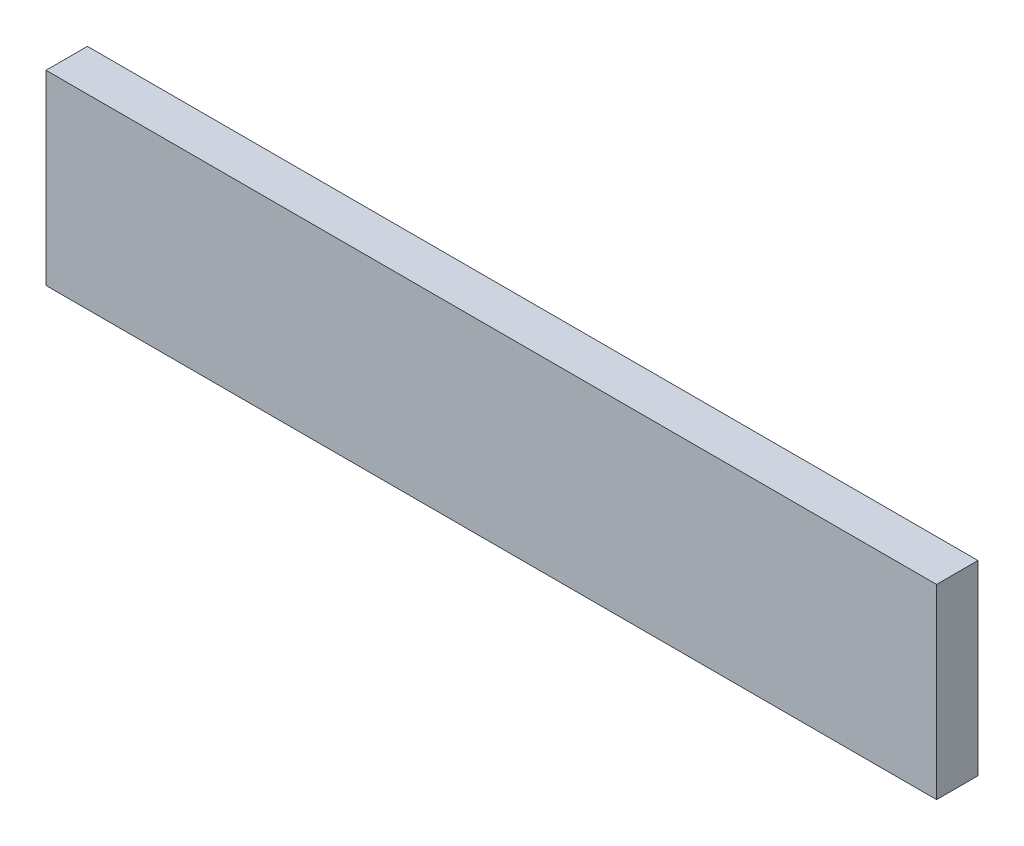
ISO-10303-21;
HEADER;
FILE_DESCRIPTION(('STEP AP214'),'2;1');
FILE_NAME('part.step','',(''),(''),'','','');
FILE_SCHEMA(('AUTOMOTIVE_DESIGN { 1 0 10303 214 1 1 1 1 }'));
ENDSEC;
DATA;
#1=APPLICATION_CONTEXT('core data for automotive mechanical design processes');
#2=APPLICATION_PROTOCOL_DEFINITION('international standard','automotive_design',2000,#1);
#3=PRODUCT_CONTEXT('',#1,'mechanical');
#4=PRODUCT('Part','Part','',(#3));
#5=PRODUCT_RELATED_PRODUCT_CATEGORY('part','',(#4));
#6=PRODUCT_DEFINITION_FORMATION('','',#4);
#7=PRODUCT_DEFINITION_CONTEXT('part definition',#1,'design');
#8=PRODUCT_DEFINITION('design','',#6,#7);
#9=PRODUCT_DEFINITION_SHAPE('','',#8);
#10=(LENGTH_UNIT() NAMED_UNIT(*) SI_UNIT(.MILLI.,.METRE.));
#11=(NAMED_UNIT(*) PLANE_ANGLE_UNIT() SI_UNIT($,.RADIAN.));
#12=(NAMED_UNIT(*) SI_UNIT($,.STERADIAN.) SOLID_ANGLE_UNIT());
#13=UNCERTAINTY_MEASURE_WITH_UNIT(LENGTH_MEASURE(1.E-05),#10,'distance_accuracy_value','');
#14=(GEOMETRIC_REPRESENTATION_CONTEXT(3) GLOBAL_UNCERTAINTY_ASSIGNED_CONTEXT((#13)) GLOBAL_UNIT_ASSIGNED_CONTEXT((#10,
#11,#12)) REPRESENTATION_CONTEXT('',''));
#15=CARTESIAN_POINT('',(0.,0.,0.));
#16=DIRECTION('',(0.,0.,1.));
#17=DIRECTION('',(1.,0.,0.));
#18=AXIS2_PLACEMENT_3D('',#15,#16,#17);
#19=CARTESIAN_POINT('',(0.,18.,4.));
#20=DIRECTION('',(1.,0.,0.));
#21=DIRECTION('',(0.,0.,-1.));
#22=AXIS2_PLACEMENT_3D('',#19,#20,#21);
#23=PLANE('',#22);
#24=DIRECTION('',(0.,-1.,0.));
#25=VECTOR('',#24,1.);
#26=CARTESIAN_POINT('',(0.,18.,0.));
#27=LINE('',#26,#25);
#28=CARTESIAN_POINT('',(0.,18.,0.));
#29=VERTEX_POINT('',#28);
#30=CARTESIAN_POINT('',(0.,0.,0.));
#31=VERTEX_POINT('',#30);
#32=EDGE_CURVE('E102',#29,#31,#27,.T.);
#33=ORIENTED_EDGE('',*,*,#32,.T.);
#34=DIRECTION('',(0.,0.,-1.));
#35=VECTOR('',#34,1.);
#36=CARTESIAN_POINT('',(0.,0.,4.));
#37=LINE('',#36,#35);
#38=CARTESIAN_POINT('',(0.,0.,4.));
#39=VERTEX_POINT('',#38);
#40=EDGE_CURVE('E11',#39,#31,#37,.T.);
#41=ORIENTED_EDGE('',*,*,#40,.F.);
#42=DIRECTION('',(0.,-1.,0.));
#43=VECTOR('',#42,1.);
#44=CARTESIAN_POINT('',(0.,18.,4.));
#45=LINE('',#44,#43);
#46=CARTESIAN_POINT('',(0.,18.,4.));
#47=VERTEX_POINT('',#46);
#48=EDGE_CURVE('E90',#47,#39,#45,.T.);
#49=ORIENTED_EDGE('',*,*,#48,.F.);
#50=DIRECTION('',(0.,0.,-1.));
#51=VECTOR('',#50,1.);
#52=CARTESIAN_POINT('',(0.,18.,4.));
#53=LINE('',#52,#51);
#54=EDGE_CURVE('E98',#47,#29,#53,.T.);
#55=ORIENTED_EDGE('',*,*,#54,.T.);
#56=EDGE_LOOP('',(#33,#41,#49,#55));
#57=FACE_BOUND('',#56,.T.);
#58=ADVANCED_FACE('F39',(#57),#23,.F.);
#59=CARTESIAN_POINT('',(0.,0.,4.));
#60=DIRECTION('',(0.,1.,0.));
#61=DIRECTION('',(0.,0.,1.));
#62=AXIS2_PLACEMENT_3D('',#59,#60,#61);
#63=PLANE('',#62);
#64=DIRECTION('',(1.,0.,0.));
#65=VECTOR('',#64,1.);
#66=CARTESIAN_POINT('',(0.,0.,0.));
#67=LINE('',#66,#65);
#68=CARTESIAN_POINT('',(86.,0.,0.));
#69=VERTEX_POINT('',#68);
#70=EDGE_CURVE('E94',#31,#69,#67,.T.);
#71=ORIENTED_EDGE('',*,*,#70,.T.);
#72=DIRECTION('',(0.,0.,-1.));
#73=VECTOR('',#72,1.);
#74=CARTESIAN_POINT('',(86.,0.,4.));
#75=LINE('',#74,#73);
#76=CARTESIAN_POINT('',(86.,0.,4.));
#77=VERTEX_POINT('',#76);
#78=EDGE_CURVE('E47',#77,#69,#75,.T.);
#79=ORIENTED_EDGE('',*,*,#78,.F.);
#80=DIRECTION('',(1.,0.,0.));
#81=VECTOR('',#80,1.);
#82=CARTESIAN_POINT('',(0.,0.,4.));
#83=LINE('',#82,#81);
#84=EDGE_CURVE('E85',#39,#77,#83,.T.);
#85=ORIENTED_EDGE('',*,*,#84,.F.);
#86=ORIENTED_EDGE('',*,*,#40,.T.);
#87=EDGE_LOOP('',(#71,#79,#85,#86));
#88=FACE_BOUND('',#87,.T.);
#89=ADVANCED_FACE('F93',(#88),#63,.F.);
#90=CARTESIAN_POINT('',(86.,0.,4.));
#91=DIRECTION('',(-1.,0.,0.));
#92=DIRECTION('',(0.,0.,1.));
#93=AXIS2_PLACEMENT_3D('',#90,#91,#92);
#94=PLANE('',#93);
#95=DIRECTION('',(0.,1.,0.));
#96=VECTOR('',#95,1.);
#97=CARTESIAN_POINT('',(86.,0.,0.));
#98=LINE('',#97,#96);
#99=CARTESIAN_POINT('',(86.,18.,0.));
#100=VERTEX_POINT('',#99);
#101=EDGE_CURVE('E72',#69,#100,#98,.T.);
#102=ORIENTED_EDGE('',*,*,#101,.T.);
#103=DIRECTION('',(0.,0.,-1.));
#104=VECTOR('',#103,1.);
#105=CARTESIAN_POINT('',(86.,18.,4.));
#106=LINE('',#105,#104);
#107=CARTESIAN_POINT('',(86.,18.,4.));
#108=VERTEX_POINT('',#107);
#109=EDGE_CURVE('E95',#108,#100,#106,.T.);
#110=ORIENTED_EDGE('',*,*,#109,.F.);
#111=DIRECTION('',(0.,1.,0.));
#112=VECTOR('',#111,1.);
#113=CARTESIAN_POINT('',(86.,0.,4.));
#114=LINE('',#113,#112);
#115=EDGE_CURVE('E88',#77,#108,#114,.T.);
#116=ORIENTED_EDGE('',*,*,#115,.F.);
#117=ORIENTED_EDGE('',*,*,#78,.T.);
#118=EDGE_LOOP('',(#102,#110,#116,#117));
#119=FACE_BOUND('',#118,.T.);
#120=ADVANCED_FACE('F96',(#119),#94,.F.);
#121=CARTESIAN_POINT('',(86.,18.,4.));
#122=DIRECTION('',(0.,-1.,0.));
#123=DIRECTION('',(0.,0.,-1.));
#124=AXIS2_PLACEMENT_3D('',#121,#122,#123);
#125=PLANE('',#124);
#126=DIRECTION('',(-1.,0.,0.));
#127=VECTOR('',#126,1.);
#128=CARTESIAN_POINT('',(86.,18.,0.));
#129=LINE('',#128,#127);
#130=EDGE_CURVE('E78',#100,#29,#129,.T.);
#131=ORIENTED_EDGE('',*,*,#130,.T.);
#132=ORIENTED_EDGE('',*,*,#54,.F.);
#133=DIRECTION('',(-1.,0.,0.));
#134=VECTOR('',#133,1.);
#135=CARTESIAN_POINT('',(86.,18.,4.));
#136=LINE('',#135,#134);
#137=EDGE_CURVE('E55',#108,#47,#136,.T.);
#138=ORIENTED_EDGE('',*,*,#137,.F.);
#139=ORIENTED_EDGE('',*,*,#109,.T.);
#140=EDGE_LOOP('',(#131,#132,#138,#139));
#141=FACE_BOUND('',#140,.T.);
#142=ADVANCED_FACE('F109',(#141),#125,.F.);
#143=CARTESIAN_POINT('',(0.,0.,4.));
#144=DIRECTION('',(0.,0.,1.));
#145=DIRECTION('',(1.,0.,0.));
#146=AXIS2_PLACEMENT_3D('',#143,#144,#145);
#147=PLANE('',#146);
#148=ORIENTED_EDGE('',*,*,#48,.T.);
#149=ORIENTED_EDGE('',*,*,#84,.T.);
#150=ORIENTED_EDGE('',*,*,#115,.T.);
#151=ORIENTED_EDGE('',*,*,#137,.T.);
#152=EDGE_LOOP('',(#148,#149,#150,#151));
#153=FACE_BOUND('',#152,.T.);
#154=ADVANCED_FACE('F86',(#153),#147,.T.);
#155=CARTESIAN_POINT('',(0.,0.,0.));
#156=DIRECTION('',(0.,0.,1.));
#157=DIRECTION('',(1.,0.,0.));
#158=AXIS2_PLACEMENT_3D('',#155,#156,#157);
#159=PLANE('',#158);
#160=ORIENTED_EDGE('',*,*,#32,.F.);
#161=ORIENTED_EDGE('',*,*,#130,.F.);
#162=ORIENTED_EDGE('',*,*,#101,.F.);
#163=ORIENTED_EDGE('',*,*,#70,.F.);
#164=EDGE_LOOP('',(#160,#161,#162,#163));
#165=FACE_BOUND('',#164,.T.);
#166=ADVANCED_FACE('F112',(#165),#159,.F.);
#167=CLOSED_SHELL('',(#58,#89,#120,#142,#154,#166));
#168=MANIFOLD_SOLID_BREP('B2',#167);
#169=ADVANCED_BREP_SHAPE_REPRESENTATION('',(#18,#168),#14);
#170=SHAPE_DEFINITION_REPRESENTATION(#9,#169);
ENDSEC;
END-ISO-10303-21;
